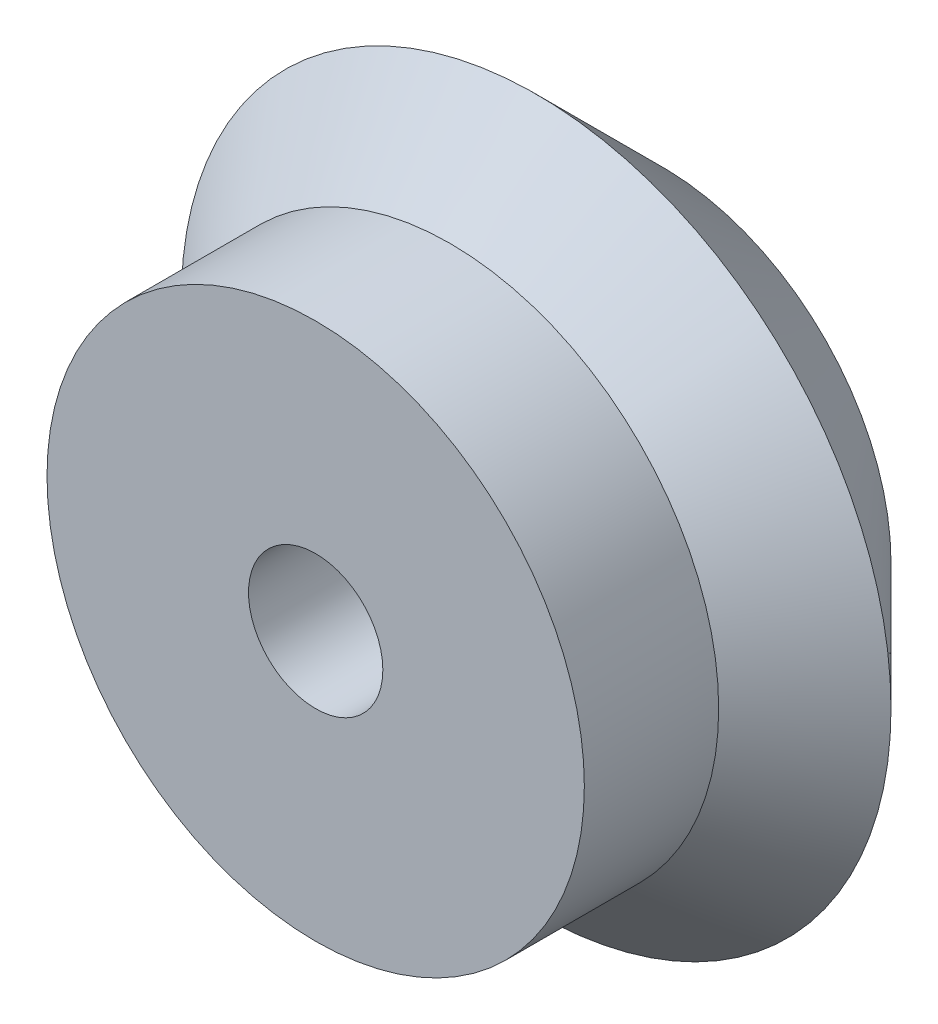
ISO-10303-21;
HEADER;
FILE_DESCRIPTION(('STEP AP214'),'2;1');
FILE_NAME('part.step','',(''),(''),'','','');
FILE_SCHEMA(('AUTOMOTIVE_DESIGN { 1 0 10303 214 1 1 1 1 }'));
ENDSEC;
DATA;
#1=APPLICATION_CONTEXT('core data for automotive mechanical design processes');
#2=APPLICATION_PROTOCOL_DEFINITION('international standard','automotive_design',2000,#1);
#3=PRODUCT_CONTEXT('',#1,'mechanical');
#4=PRODUCT('Part','Part','',(#3));
#5=PRODUCT_RELATED_PRODUCT_CATEGORY('part','',(#4));
#6=PRODUCT_DEFINITION_FORMATION('','',#4);
#7=PRODUCT_DEFINITION_CONTEXT('part definition',#1,'design');
#8=PRODUCT_DEFINITION('design','',#6,#7);
#9=PRODUCT_DEFINITION_SHAPE('','',#8);
#10=(LENGTH_UNIT() NAMED_UNIT(*) SI_UNIT(.MILLI.,.METRE.));
#11=(NAMED_UNIT(*) PLANE_ANGLE_UNIT() SI_UNIT($,.RADIAN.));
#12=(NAMED_UNIT(*) SI_UNIT($,.STERADIAN.) SOLID_ANGLE_UNIT());
#13=UNCERTAINTY_MEASURE_WITH_UNIT(LENGTH_MEASURE(1.E-05),#10,'distance_accuracy_value','');
#14=(GEOMETRIC_REPRESENTATION_CONTEXT(3) GLOBAL_UNCERTAINTY_ASSIGNED_CONTEXT((#13)) GLOBAL_UNIT_ASSIGNED_CONTEXT((#10,
#11,#12)) REPRESENTATION_CONTEXT('',''));
#15=CARTESIAN_POINT('',(0.,0.,0.));
#16=DIRECTION('',(0.,0.,1.));
#17=DIRECTION('',(1.,0.,0.));
#18=AXIS2_PLACEMENT_3D('',#15,#16,#17);
#19=CARTESIAN_POINT('',(0.,0.,15.));
#20=DIRECTION('',(0.,0.,1.));
#21=DIRECTION('',(1.,0.,0.));
#22=AXIS2_PLACEMENT_3D('',#19,#20,#21);
#23=PLANE('',#22);
#24=CARTESIAN_POINT('',(0.,0.,15.));
#25=DIRECTION('',(0.,0.,1.));
#26=DIRECTION('',(1.,0.,0.));
#27=AXIS2_PLACEMENT_3D('',#24,#25,#26);
#28=CIRCLE('',#27,30.);
#29=CARTESIAN_POINT('',(30.,0.,15.));
#30=VERTEX_POINT('',#29);
#31=EDGE_CURVE('E10',#30,#30,#28,.T.);
#32=ORIENTED_EDGE('',*,*,#31,.T.);
#33=EDGE_LOOP('',(#32));
#34=FACE_BOUND('',#33,.T.);
#35=CARTESIAN_POINT('',(0.,0.,15.));
#36=DIRECTION('',(0.,0.,1.));
#37=DIRECTION('',(1.,0.,0.));
#38=AXIS2_PLACEMENT_3D('',#35,#36,#37);
#39=CIRCLE('',#38,7.5);
#40=CARTESIAN_POINT('',(7.5,0.,15.));
#41=VERTEX_POINT('',#40);
#42=EDGE_CURVE('E45',#41,#41,#39,.T.);
#43=ORIENTED_EDGE('',*,*,#42,.F.);
#44=EDGE_LOOP('',(#43));
#45=FACE_BOUND('',#44,.T.);
#46=ADVANCED_FACE('F38',(#34,#45),#23,.T.);
#47=CARTESIAN_POINT('',(0.,0.,15.));
#48=DIRECTION('',(0.,0.,-1.));
#49=DIRECTION('',(-1.,0.,0.));
#50=AXIS2_PLACEMENT_3D('',#47,#48,#49);
#51=CYLINDRICAL_SURFACE('',#50,30.);
#52=ORIENTED_EDGE('',*,*,#31,.F.);
#53=EDGE_LOOP('',(#52));
#54=FACE_BOUND('',#53,.T.);
#55=CARTESIAN_POINT('',(0.,0.,0.));
#56=DIRECTION('',(0.,0.,1.));
#57=DIRECTION('',(1.,0.,0.));
#58=AXIS2_PLACEMENT_3D('',#55,#56,#57);
#59=CIRCLE('',#58,30.);
#60=CARTESIAN_POINT('',(30.,0.,0.));
#61=VERTEX_POINT('',#60);
#62=EDGE_CURVE('E53',#61,#61,#59,.T.);
#63=ORIENTED_EDGE('',*,*,#62,.T.);
#64=EDGE_LOOP('',(#63));
#65=FACE_BOUND('',#64,.T.);
#66=ADVANCED_FACE('F40',(#54,#65),#51,.T.);
#67=CARTESIAN_POINT('',(0.,0.,15.));
#68=DIRECTION('',(0.,0.,-1.));
#69=DIRECTION('',(-1.,0.,0.));
#70=AXIS2_PLACEMENT_3D('',#67,#68,#69);
#71=CYLINDRICAL_SURFACE('',#70,7.5);
#72=ORIENTED_EDGE('',*,*,#42,.T.);
#73=EDGE_LOOP('',(#72));
#74=FACE_BOUND('',#73,.T.);
#75=CARTESIAN_POINT('',(0.,0.,-17.));
#76=DIRECTION('',(0.,0.,1.));
#77=DIRECTION('',(1.,0.,0.));
#78=AXIS2_PLACEMENT_3D('',#75,#76,#77);
#79=CIRCLE('',#78,7.5);
#80=CARTESIAN_POINT('',(7.5,0.,-17.));
#81=VERTEX_POINT('',#80);
#82=EDGE_CURVE('E49',#81,#81,#79,.T.);
#83=ORIENTED_EDGE('',*,*,#82,.F.);
#84=EDGE_LOOP('',(#83));
#85=FACE_BOUND('',#84,.T.);
#86=ADVANCED_FACE('F74',(#74,#85),#71,.F.);
#87=CARTESIAN_POINT('',(0.,0.,-17.));
#88=DIRECTION('',(0.,0.,-1.));
#89=DIRECTION('',(-1.,0.,0.));
#90=AXIS2_PLACEMENT_3D('',#87,#88,#89);
#91=PLANE('',#90);
#92=ORIENTED_EDGE('',*,*,#82,.T.);
#93=EDGE_LOOP('',(#92));
#94=FACE_BOUND('',#93,.T.);
#95=CARTESIAN_POINT('',(0.,0.,-17.));
#96=DIRECTION('',(0.,0.,1.));
#97=DIRECTION('',(1.,0.,0.));
#98=AXIS2_PLACEMENT_3D('',#95,#96,#97);
#99=CIRCLE('',#98,17.967751925581);
#100=CARTESIAN_POINT('',(17.967751925581,0.,-17.));
#101=VERTEX_POINT('',#100);
#102=EDGE_CURVE('E64',#101,#101,#99,.T.);
#103=ORIENTED_EDGE('',*,*,#102,.F.);
#104=EDGE_LOOP('',(#103));
#105=FACE_BOUND('',#104,.T.);
#106=ADVANCED_FACE('F71',(#94,#105),#91,.T.);
#107=CARTESIAN_POINT('',(0.,0.,0.));
#108=DIRECTION('',(0.,0.,-1.));
#109=DIRECTION('',(-1.,0.,0.));
#110=AXIS2_PLACEMENT_3D('',#107,#108,#109);
#111=CONICAL_SURFACE('',#110,30.,0.785398163397446);
#112=CARTESIAN_POINT('',(0.,0.,-9.62000000000003));
#113=DIRECTION('',(0.,0.,1.));
#114=DIRECTION('',(1.,0.,0.));
#115=AXIS2_PLACEMENT_3D('',#112,#113,#114);
#116=CIRCLE('',#115,39.62);
#117=CARTESIAN_POINT('',(39.62,0.,-9.62000000000003));
#118=VERTEX_POINT('',#117);
#119=EDGE_CURVE('E58',#118,#118,#116,.T.);
#120=ORIENTED_EDGE('',*,*,#119,.T.);
#121=EDGE_LOOP('',(#120));
#122=FACE_BOUND('',#121,.T.);
#123=ORIENTED_EDGE('',*,*,#62,.F.);
#124=EDGE_LOOP('',(#123));
#125=FACE_BOUND('',#124,.T.);
#126=ADVANCED_FACE('F73',(#122,#125),#111,.T.);
#127=CARTESIAN_POINT('',(0.,0.,-9.62000000000003));
#128=DIRECTION('',(0.,0.,1.));
#129=DIRECTION('',(1.,0.,0.));
#130=AXIS2_PLACEMENT_3D('',#127,#128,#129);
#131=CONICAL_SURFACE('',#130,39.62,0.78539816339745);
#132=CARTESIAN_POINT('',(0.,0.,-23.762135623731));
#133=DIRECTION('',(0.,0.,1.));
#134=DIRECTION('',(1.,0.,0.));
#135=AXIS2_PLACEMENT_3D('',#132,#133,#134);
#136=CIRCLE('',#135,25.477864376269);
#137=CARTESIAN_POINT('',(25.477864376269,0.,-23.762135623731));
#138=VERTEX_POINT('',#137);
#139=EDGE_CURVE('E61',#138,#138,#136,.T.);
#140=ORIENTED_EDGE('',*,*,#139,.T.);
#141=EDGE_LOOP('',(#140));
#142=FACE_BOUND('',#141,.T.);
#143=ORIENTED_EDGE('',*,*,#119,.F.);
#144=EDGE_LOOP('',(#143));
#145=FACE_BOUND('',#144,.T.);
#146=ADVANCED_FACE('F81',(#142,#145),#131,.T.);
#147=CARTESIAN_POINT('',(0.,0.,-23.762135623731));
#148=DIRECTION('',(0.,0.,-1.));
#149=DIRECTION('',(-1.,0.,0.));
#150=AXIS2_PLACEMENT_3D('',#147,#148,#149);
#151=CONICAL_SURFACE('',#150,25.477864376269,0.837758040957284);
#152=ORIENTED_EDGE('',*,*,#102,.T.);
#153=EDGE_LOOP('',(#152));
#154=FACE_BOUND('',#153,.T.);
#155=ORIENTED_EDGE('',*,*,#139,.F.);
#156=EDGE_LOOP('',(#155));
#157=FACE_BOUND('',#156,.T.);
#158=ADVANCED_FACE('F68',(#154,#157),#151,.F.);
#159=CLOSED_SHELL('',(#46,#66,#86,#106,#126,#146,#158));
#160=MANIFOLD_SOLID_BREP('B2',#159);
#161=ADVANCED_BREP_SHAPE_REPRESENTATION('',(#18,#160),#14);
#162=SHAPE_DEFINITION_REPRESENTATION(#9,#161);
ENDSEC;
END-ISO-10303-21;
